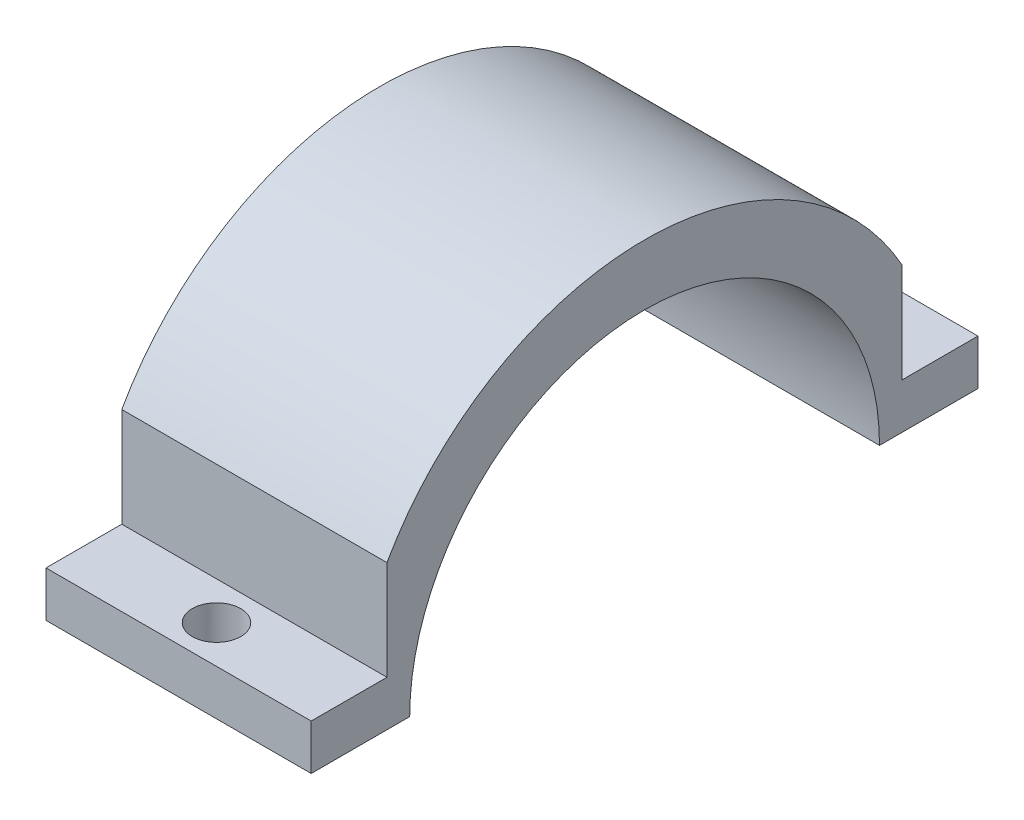
ISO-10303-21;
HEADER;
FILE_DESCRIPTION(('STEP AP214'),'2;1');
FILE_NAME('part.step','',(''),(''),'','','');
FILE_SCHEMA(('AUTOMOTIVE_DESIGN { 1 0 10303 214 1 1 1 1 }'));
ENDSEC;
DATA;
#1=APPLICATION_CONTEXT('core data for automotive mechanical design processes');
#2=APPLICATION_PROTOCOL_DEFINITION('international standard','automotive_design',2000,#1);
#3=PRODUCT_CONTEXT('',#1,'mechanical');
#4=PRODUCT('Part','Part','',(#3));
#5=PRODUCT_RELATED_PRODUCT_CATEGORY('part','',(#4));
#6=PRODUCT_DEFINITION_FORMATION('','',#4);
#7=PRODUCT_DEFINITION_CONTEXT('part definition',#1,'design');
#8=PRODUCT_DEFINITION('design','',#6,#7);
#9=PRODUCT_DEFINITION_SHAPE('','',#8);
#10=(LENGTH_UNIT() NAMED_UNIT(*) SI_UNIT(.MILLI.,.METRE.));
#11=(NAMED_UNIT(*) PLANE_ANGLE_UNIT() SI_UNIT($,.RADIAN.));
#12=(NAMED_UNIT(*) SI_UNIT($,.STERADIAN.) SOLID_ANGLE_UNIT());
#13=UNCERTAINTY_MEASURE_WITH_UNIT(LENGTH_MEASURE(1.E-05),#10,'distance_accuracy_value','');
#14=(GEOMETRIC_REPRESENTATION_CONTEXT(3) GLOBAL_UNCERTAINTY_ASSIGNED_CONTEXT((#13)) GLOBAL_UNIT_ASSIGNED_CONTEXT((#10,
#11,#12)) REPRESENTATION_CONTEXT('',''));
#15=CARTESIAN_POINT('',(0.,0.,0.));
#16=DIRECTION('',(0.,0.,1.));
#17=DIRECTION('',(1.,0.,0.));
#18=AXIS2_PLACEMENT_3D('',#15,#16,#17);
#19=CARTESIAN_POINT('',(17.,50.,0.));
#20=DIRECTION('',(-1.,0.,0.));
#21=DIRECTION('',(0.,0.,1.));
#22=AXIS2_PLACEMENT_3D('',#19,#20,#21);
#23=PLANE('',#22);
#24=CARTESIAN_POINT('',(17.,4.5,22.));
#25=DIRECTION('',(-1.,0.,0.));
#26=DIRECTION('',(0.,0.,1.));
#27=AXIS2_PLACEMENT_3D('',#24,#25,#26);
#28=CIRCLE('',#27,19.5);
#29=CARTESIAN_POINT('',(17.,14.0524865872714,39.));
#30=VERTEX_POINT('',#29);
#31=CARTESIAN_POINT('',(17.,14.0524865872713,5.00000000000001));
#32=VERTEX_POINT('',#31);
#33=EDGE_CURVE('E71',#30,#32,#28,.T.);
#34=ORIENTED_EDGE('',*,*,#33,.F.);
#35=DIRECTION('',(0.,-1.,0.));
#36=VECTOR('',#35,1.);
#37=CARTESIAN_POINT('',(17.,50.,39.));
#38=LINE('',#37,#36);
#39=CARTESIAN_POINT('',(17.,7.5,39.));
#40=VERTEX_POINT('',#39);
#41=EDGE_CURVE('E44',#30,#40,#38,.T.);
#42=ORIENTED_EDGE('',*,*,#41,.T.);
#43=DIRECTION('',(0.,0.,-1.));
#44=VECTOR('',#43,1.);
#45=CARTESIAN_POINT('',(17.,7.5,39.));
#46=LINE('',#45,#44);
#47=CARTESIAN_POINT('',(17.,7.5,44.));
#48=VERTEX_POINT('',#47);
#49=EDGE_CURVE('E174',#48,#40,#46,.T.);
#50=ORIENTED_EDGE('',*,*,#49,.F.);
#51=DIRECTION('',(0.,1.,0.));
#52=VECTOR('',#51,1.);
#53=CARTESIAN_POINT('',(17.,7.5,44.));
#54=LINE('',#53,#52);
#55=CARTESIAN_POINT('',(17.,4.5,44.));
#56=VERTEX_POINT('',#55);
#57=EDGE_CURVE('E179',#56,#48,#54,.T.);
#58=ORIENTED_EDGE('',*,*,#57,.F.);
#59=DIRECTION('',(0.,0.,1.));
#60=VECTOR('',#59,1.);
#61=CARTESIAN_POINT('',(17.,4.5,0.));
#62=LINE('',#61,#60);
#63=CARTESIAN_POINT('',(17.,4.5,37.5));
#64=VERTEX_POINT('',#63);
#65=EDGE_CURVE('E134',#64,#56,#62,.T.);
#66=ORIENTED_EDGE('',*,*,#65,.F.);
#67=CARTESIAN_POINT('',(17.,4.50000000000002,22.));
#68=DIRECTION('',(1.,0.,0.));
#69=DIRECTION('',(0.,0.,-1.));
#70=AXIS2_PLACEMENT_3D('',#67,#68,#69);
#71=CIRCLE('',#70,15.5);
#72=CARTESIAN_POINT('',(17.,4.5,6.50000000000006));
#73=VERTEX_POINT('',#72);
#74=EDGE_CURVE('E133',#73,#64,#71,.T.);
#75=ORIENTED_EDGE('',*,*,#74,.F.);
#76=CARTESIAN_POINT('',(17.,4.5,0.));
#77=VERTEX_POINT('',#76);
#78=EDGE_CURVE('E147',#77,#73,#62,.T.);
#79=ORIENTED_EDGE('',*,*,#78,.F.);
#80=DIRECTION('',(0.,-1.,0.));
#81=VECTOR('',#80,1.);
#82=CARTESIAN_POINT('',(17.,7.5,0.));
#83=LINE('',#82,#81);
#84=CARTESIAN_POINT('',(17.,7.5,0.));
#85=VERTEX_POINT('',#84);
#86=EDGE_CURVE('E191',#85,#77,#83,.T.);
#87=ORIENTED_EDGE('',*,*,#86,.F.);
#88=DIRECTION('',(0.,0.,-1.));
#89=VECTOR('',#88,1.);
#90=CARTESIAN_POINT('',(17.,7.5,5.00000000000001));
#91=LINE('',#90,#89);
#92=CARTESIAN_POINT('',(17.,7.5,5.00000000000001));
#93=VERTEX_POINT('',#92);
#94=EDGE_CURVE('E188',#93,#85,#91,.T.);
#95=ORIENTED_EDGE('',*,*,#94,.F.);
#96=DIRECTION('',(0.,1.,0.));
#97=VECTOR('',#96,1.);
#98=CARTESIAN_POINT('',(17.,0.,5.));
#99=LINE('',#98,#97);
#100=EDGE_CURVE('E157',#93,#32,#99,.T.);
#101=ORIENTED_EDGE('',*,*,#100,.T.);
#102=EDGE_LOOP('',(#34,#42,#50,#58,#66,#75,#79,#87,#95,#101));
#103=FACE_BOUND('',#102,.T.);
#104=ADVANCED_FACE('F35',(#103),#23,.F.);
#105=CARTESIAN_POINT('',(-0.499999999999994,50.,0.));
#106=DIRECTION('',(-1.,0.,0.));
#107=DIRECTION('',(0.,0.,1.));
#108=AXIS2_PLACEMENT_3D('',#105,#106,#107);
#109=PLANE('',#108);
#110=DIRECTION('',(0.,-1.,0.));
#111=VECTOR('',#110,1.);
#112=CARTESIAN_POINT('',(-0.499999999999917,50.,39.));
#113=LINE('',#112,#111);
#114=CARTESIAN_POINT('',(-0.499999999999917,14.0524865872714,39.));
#115=VERTEX_POINT('',#114);
#116=CARTESIAN_POINT('',(-0.499999999999994,7.5,39.));
#117=VERTEX_POINT('',#116);
#118=EDGE_CURVE('E160',#115,#117,#113,.T.);
#119=ORIENTED_EDGE('',*,*,#118,.F.);
#120=CARTESIAN_POINT('',(-0.499999999999952,4.5,22.));
#121=DIRECTION('',(-1.,0.,0.));
#122=DIRECTION('',(0.,0.,1.));
#123=AXIS2_PLACEMENT_3D('',#120,#121,#122);
#124=CIRCLE('',#123,19.5);
#125=CARTESIAN_POINT('',(-0.499999999999973,14.0524865872713,5.00000000000001));
#126=VERTEX_POINT('',#125);
#127=EDGE_CURVE('E38',#115,#126,#124,.T.);
#128=ORIENTED_EDGE('',*,*,#127,.T.);
#129=DIRECTION('',(0.,1.,0.));
#130=VECTOR('',#129,1.);
#131=CARTESIAN_POINT('',(-0.499999999999994,0.,5.));
#132=LINE('',#131,#130);
#133=CARTESIAN_POINT('',(-0.499999999999994,7.5,5.));
#134=VERTEX_POINT('',#133);
#135=EDGE_CURVE('E154',#134,#126,#132,.T.);
#136=ORIENTED_EDGE('',*,*,#135,.F.);
#137=DIRECTION('',(0.,0.,-1.));
#138=VECTOR('',#137,1.);
#139=CARTESIAN_POINT('',(-0.499999999999994,7.5,5.00000000000001));
#140=LINE('',#139,#138);
#141=CARTESIAN_POINT('',(-0.499999999999994,7.5,0.));
#142=VERTEX_POINT('',#141);
#143=EDGE_CURVE('E175',#134,#142,#140,.T.);
#144=ORIENTED_EDGE('',*,*,#143,.T.);
#145=DIRECTION('',(0.,-1.,0.));
#146=VECTOR('',#145,1.);
#147=CARTESIAN_POINT('',(-0.499999999999994,7.5,0.));
#148=LINE('',#147,#146);
#149=CARTESIAN_POINT('',(-0.499999999999994,4.5,0.));
#150=VERTEX_POINT('',#149);
#151=EDGE_CURVE('E143',#142,#150,#148,.T.);
#152=ORIENTED_EDGE('',*,*,#151,.T.);
#153=DIRECTION('',(0.,0.,1.));
#154=VECTOR('',#153,1.);
#155=CARTESIAN_POINT('',(-0.499999999999994,4.5,0.));
#156=LINE('',#155,#154);
#157=CARTESIAN_POINT('',(-0.499999999999994,4.5,6.50000000000006));
#158=VERTEX_POINT('',#157);
#159=EDGE_CURVE('E125',#150,#158,#156,.T.);
#160=ORIENTED_EDGE('',*,*,#159,.T.);
#161=CARTESIAN_POINT('',(-0.49999999999995,4.50000000000002,22.));
#162=DIRECTION('',(-1.,0.,0.));
#163=DIRECTION('',(0.,0.,1.));
#164=AXIS2_PLACEMENT_3D('',#161,#162,#163);
#165=CIRCLE('',#164,15.5);
#166=CARTESIAN_POINT('',(-0.49999999999992,4.5,37.5));
#167=VERTEX_POINT('',#166);
#168=EDGE_CURVE('E11',#167,#158,#165,.T.);
#169=ORIENTED_EDGE('',*,*,#168,.F.);
#170=CARTESIAN_POINT('',(-0.499999999999994,4.5,44.));
#171=VERTEX_POINT('',#170);
#172=EDGE_CURVE('E114',#167,#171,#156,.T.);
#173=ORIENTED_EDGE('',*,*,#172,.T.);
#174=DIRECTION('',(0.,1.,0.));
#175=VECTOR('',#174,1.);
#176=CARTESIAN_POINT('',(-0.499999999999994,7.5,44.));
#177=LINE('',#176,#175);
#178=CARTESIAN_POINT('',(-0.499999999999994,7.5,44.));
#179=VERTEX_POINT('',#178);
#180=EDGE_CURVE('E178',#171,#179,#177,.T.);
#181=ORIENTED_EDGE('',*,*,#180,.T.);
#182=DIRECTION('',(0.,0.,-1.));
#183=VECTOR('',#182,1.);
#184=CARTESIAN_POINT('',(-0.499999999999994,7.5,39.));
#185=LINE('',#184,#183);
#186=EDGE_CURVE('E173',#179,#117,#185,.T.);
#187=ORIENTED_EDGE('',*,*,#186,.T.);
#188=EDGE_LOOP('',(#119,#128,#136,#144,#152,#160,#169,#173,#181,#187));
#189=FACE_BOUND('',#188,.T.);
#190=ADVANCED_FACE('F139',(#189),#109,.T.);
#191=CARTESIAN_POINT('',(17.,50.,39.));
#192=DIRECTION('',(0.,0.,-1.));
#193=DIRECTION('',(-1.,0.,0.));
#194=AXIS2_PLACEMENT_3D('',#191,#192,#193);
#195=PLANE('',#194);
#196=DIRECTION('',(-1.,0.,0.));
#197=VECTOR('',#196,1.);
#198=CARTESIAN_POINT('',(17.,14.0524865872714,39.));
#199=LINE('',#198,#197);
#200=EDGE_CURVE('E168',#30,#115,#199,.T.);
#201=ORIENTED_EDGE('',*,*,#200,.T.);
#202=ORIENTED_EDGE('',*,*,#118,.T.);
#203=DIRECTION('',(-1.,0.,0.));
#204=VECTOR('',#203,1.);
#205=CARTESIAN_POINT('',(17.,7.5,39.));
#206=LINE('',#205,#204);
#207=EDGE_CURVE('E166',#40,#117,#206,.T.);
#208=ORIENTED_EDGE('',*,*,#207,.F.);
#209=ORIENTED_EDGE('',*,*,#41,.F.);
#210=EDGE_LOOP('',(#201,#202,#208,#209));
#211=FACE_BOUND('',#210,.T.);
#212=ADVANCED_FACE('F165',(#211),#195,.F.);
#213=CARTESIAN_POINT('',(-0.499999999999994,0.,5.));
#214=DIRECTION('',(0.,0.,-1.));
#215=DIRECTION('',(0.,1.,0.));
#216=AXIS2_PLACEMENT_3D('',#213,#214,#215);
#217=PLANE('',#216);
#218=ORIENTED_EDGE('',*,*,#135,.T.);
#219=DIRECTION('',(-1.,0.,0.));
#220=VECTOR('',#219,1.);
#221=CARTESIAN_POINT('',(17.,14.0524865872713,5.00000000000001));
#222=LINE('',#221,#220);
#223=EDGE_CURVE('E65',#32,#126,#222,.T.);
#224=ORIENTED_EDGE('',*,*,#223,.F.);
#225=ORIENTED_EDGE('',*,*,#100,.F.);
#226=DIRECTION('',(-1.,0.,0.));
#227=VECTOR('',#226,1.);
#228=CARTESIAN_POINT('',(17.,7.5,5.00000000000001));
#229=LINE('',#228,#227);
#230=EDGE_CURVE('E150',#93,#134,#229,.T.);
#231=ORIENTED_EDGE('',*,*,#230,.T.);
#232=EDGE_LOOP('',(#218,#224,#225,#231));
#233=FACE_BOUND('',#232,.T.);
#234=ADVANCED_FACE('F202',(#233),#217,.T.);
#235=CARTESIAN_POINT('',(-0.49999999999999,4.50000000000002,22.));
#236=DIRECTION('',(1.,0.,0.));
#237=DIRECTION('',(0.,0.,-1.));
#238=AXIS2_PLACEMENT_3D('',#235,#236,#237);
#239=CYLINDRICAL_SURFACE('',#238,15.5);
#240=DIRECTION('',(1.,0.,0.));
#241=VECTOR('',#240,1.);
#242=CARTESIAN_POINT('',(-0.499999999999991,4.5,6.50000000000006));
#243=LINE('',#242,#241);
#244=EDGE_CURVE('E135',#73,#158,#243,.F.);
#245=ORIENTED_EDGE('',*,*,#244,.F.);
#246=ORIENTED_EDGE('',*,*,#74,.T.);
#247=DIRECTION('',(1.,0.,0.));
#248=VECTOR('',#247,1.);
#249=CARTESIAN_POINT('',(-0.499999999999989,4.5,37.5));
#250=LINE('',#249,#248);
#251=EDGE_CURVE('E117',#167,#64,#250,.T.);
#252=ORIENTED_EDGE('',*,*,#251,.F.);
#253=ORIENTED_EDGE('',*,*,#168,.T.);
#254=EDGE_LOOP('',(#245,#246,#252,#253));
#255=FACE_BOUND('',#254,.T.);
#256=ADVANCED_FACE('F131',(#255),#239,.F.);
#257=CARTESIAN_POINT('',(63.5,4.5,0.));
#258=DIRECTION('',(0.,-1.,0.));
#259=DIRECTION('',(0.,0.,-1.));
#260=AXIS2_PLACEMENT_3D('',#257,#258,#259);
#261=PLANE('',#260);
#262=CARTESIAN_POINT('',(8.25,4.5,2.50000000000001));
#263=DIRECTION('',(0.,-1.,0.));
#264=DIRECTION('',(0.,0.,-1.));
#265=AXIS2_PLACEMENT_3D('',#262,#263,#264);
#266=CIRCLE('',#265,1.6);
#267=CARTESIAN_POINT('',(8.25,4.5,0.900000000000004));
#268=VERTEX_POINT('',#267);
#269=EDGE_CURVE('E208',#268,#268,#266,.T.);
#270=ORIENTED_EDGE('',*,*,#269,.F.);
#271=EDGE_LOOP('',(#270));
#272=FACE_BOUND('',#271,.T.);
#273=ORIENTED_EDGE('',*,*,#244,.T.);
#274=ORIENTED_EDGE('',*,*,#159,.F.);
#275=DIRECTION('',(-1.,0.,0.));
#276=VECTOR('',#275,1.);
#277=CARTESIAN_POINT('',(17.,4.5,0.));
#278=LINE('',#277,#276);
#279=EDGE_CURVE('E126',#77,#150,#278,.T.);
#280=ORIENTED_EDGE('',*,*,#279,.F.);
#281=ORIENTED_EDGE('',*,*,#78,.T.);
#282=EDGE_LOOP('',(#273,#274,#280,#281));
#283=FACE_BOUND('',#282,.T.);
#284=ADVANCED_FACE('F248',(#272,#283),#261,.T.);
#285=CARTESIAN_POINT('',(8.25000000000004,4.5,41.5));
#286=DIRECTION('',(0.,-1.,0.));
#287=DIRECTION('',(0.,0.,-1.));
#288=AXIS2_PLACEMENT_3D('',#285,#286,#287);
#289=CIRCLE('',#288,1.6);
#290=CARTESIAN_POINT('',(8.25000000000004,4.5,39.9));
#291=VERTEX_POINT('',#290);
#292=EDGE_CURVE('E211',#291,#291,#289,.T.);
#293=ORIENTED_EDGE('',*,*,#292,.F.);
#294=EDGE_LOOP('',(#293));
#295=FACE_BOUND('',#294,.T.);
#296=ORIENTED_EDGE('',*,*,#65,.T.);
#297=DIRECTION('',(-1.,0.,0.));
#298=VECTOR('',#297,1.);
#299=CARTESIAN_POINT('',(17.,4.5,44.));
#300=LINE('',#299,#298);
#301=EDGE_CURVE('E120',#56,#171,#300,.T.);
#302=ORIENTED_EDGE('',*,*,#301,.T.);
#303=ORIENTED_EDGE('',*,*,#172,.F.);
#304=ORIENTED_EDGE('',*,*,#251,.T.);
#305=EDGE_LOOP('',(#296,#302,#303,#304));
#306=FACE_BOUND('',#305,.T.);
#307=ADVANCED_FACE('F116',(#295,#306),#261,.T.);
#308=CARTESIAN_POINT('',(17.,7.5,0.));
#309=DIRECTION('',(0.,0.,-1.));
#310=DIRECTION('',(0.,1.,0.));
#311=AXIS2_PLACEMENT_3D('',#308,#309,#310);
#312=PLANE('',#311);
#313=ORIENTED_EDGE('',*,*,#151,.F.);
#314=DIRECTION('',(-1.,0.,0.));
#315=VECTOR('',#314,1.);
#316=CARTESIAN_POINT('',(17.,7.5,0.));
#317=LINE('',#316,#315);
#318=EDGE_CURVE('E196',#85,#142,#317,.T.);
#319=ORIENTED_EDGE('',*,*,#318,.F.);
#320=ORIENTED_EDGE('',*,*,#86,.T.);
#321=ORIENTED_EDGE('',*,*,#279,.T.);
#322=EDGE_LOOP('',(#313,#319,#320,#321));
#323=FACE_BOUND('',#322,.T.);
#324=ADVANCED_FACE('F225',(#323),#312,.T.);
#325=CARTESIAN_POINT('',(17.,7.5,5.00000000000001));
#326=DIRECTION('',(0.,1.,0.));
#327=DIRECTION('',(0.,0.,1.));
#328=AXIS2_PLACEMENT_3D('',#325,#326,#327);
#329=PLANE('',#328);
#330=CARTESIAN_POINT('',(8.25,7.5,2.5));
#331=DIRECTION('',(0.,1.,0.));
#332=DIRECTION('',(0.,0.,1.));
#333=AXIS2_PLACEMENT_3D('',#330,#331,#332);
#334=CIRCLE('',#333,1.6);
#335=CARTESIAN_POINT('',(8.25,7.5,4.10000000000001));
#336=VERTEX_POINT('',#335);
#337=EDGE_CURVE('E214',#336,#336,#334,.T.);
#338=ORIENTED_EDGE('',*,*,#337,.F.);
#339=EDGE_LOOP('',(#338));
#340=FACE_BOUND('',#339,.T.);
#341=ORIENTED_EDGE('',*,*,#143,.F.);
#342=ORIENTED_EDGE('',*,*,#230,.F.);
#343=ORIENTED_EDGE('',*,*,#94,.T.);
#344=ORIENTED_EDGE('',*,*,#318,.T.);
#345=EDGE_LOOP('',(#341,#342,#343,#344));
#346=FACE_BOUND('',#345,.T.);
#347=ADVANCED_FACE('F223',(#340,#346),#329,.T.);
#348=CARTESIAN_POINT('',(17.,7.5,39.));
#349=DIRECTION('',(0.,1.,0.));
#350=DIRECTION('',(0.,0.,1.));
#351=AXIS2_PLACEMENT_3D('',#348,#349,#350);
#352=PLANE('',#351);
#353=CARTESIAN_POINT('',(8.25000000000004,7.50000000000001,41.5));
#354=DIRECTION('',(0.,1.,0.));
#355=DIRECTION('',(0.,0.,1.));
#356=AXIS2_PLACEMENT_3D('',#353,#354,#355);
#357=CIRCLE('',#356,1.6);
#358=CARTESIAN_POINT('',(8.25000000000004,7.50000000000001,43.1));
#359=VERTEX_POINT('',#358);
#360=EDGE_CURVE('E215',#359,#359,#357,.T.);
#361=ORIENTED_EDGE('',*,*,#360,.F.);
#362=EDGE_LOOP('',(#361));
#363=FACE_BOUND('',#362,.T.);
#364=ORIENTED_EDGE('',*,*,#186,.F.);
#365=DIRECTION('',(-1.,0.,0.));
#366=VECTOR('',#365,1.);
#367=CARTESIAN_POINT('',(17.,7.5,44.));
#368=LINE('',#367,#366);
#369=EDGE_CURVE('E176',#48,#179,#368,.T.);
#370=ORIENTED_EDGE('',*,*,#369,.F.);
#371=ORIENTED_EDGE('',*,*,#49,.T.);
#372=ORIENTED_EDGE('',*,*,#207,.T.);
#373=EDGE_LOOP('',(#364,#370,#371,#372));
#374=FACE_BOUND('',#373,.T.);
#375=ADVANCED_FACE('F172',(#363,#374),#352,.T.);
#376=CARTESIAN_POINT('',(17.,7.5,44.));
#377=DIRECTION('',(0.,0.,1.));
#378=DIRECTION('',(1.,0.,0.));
#379=AXIS2_PLACEMENT_3D('',#376,#377,#378);
#380=PLANE('',#379);
#381=ORIENTED_EDGE('',*,*,#180,.F.);
#382=ORIENTED_EDGE('',*,*,#301,.F.);
#383=ORIENTED_EDGE('',*,*,#57,.T.);
#384=ORIENTED_EDGE('',*,*,#369,.T.);
#385=EDGE_LOOP('',(#381,#382,#383,#384));
#386=FACE_BOUND('',#385,.T.);
#387=ADVANCED_FACE('F231',(#386),#380,.T.);
#388=CARTESIAN_POINT('',(17.,4.5,22.));
#389=DIRECTION('',(-1.,0.,0.));
#390=DIRECTION('',(0.,0.,1.));
#391=AXIS2_PLACEMENT_3D('',#388,#389,#390);
#392=CYLINDRICAL_SURFACE('',#391,19.5);
#393=ORIENTED_EDGE('',*,*,#127,.F.);
#394=ORIENTED_EDGE('',*,*,#200,.F.);
#395=ORIENTED_EDGE('',*,*,#33,.T.);
#396=ORIENTED_EDGE('',*,*,#223,.T.);
#397=EDGE_LOOP('',(#393,#394,#395,#396));
#398=FACE_BOUND('',#397,.T.);
#399=ADVANCED_FACE('F261',(#398),#392,.T.);
#400=CARTESIAN_POINT('',(8.25000000000004,-56.5,41.5));
#401=DIRECTION('',(0.,1.,0.));
#402=DIRECTION('',(0.,0.,1.));
#403=AXIS2_PLACEMENT_3D('',#400,#401,#402);
#404=CYLINDRICAL_SURFACE('',#403,1.6);
#405=ORIENTED_EDGE('',*,*,#292,.T.);
#406=EDGE_LOOP('',(#405));
#407=FACE_BOUND('',#406,.T.);
#408=ORIENTED_EDGE('',*,*,#360,.T.);
#409=EDGE_LOOP('',(#408));
#410=FACE_BOUND('',#409,.T.);
#411=ADVANCED_FACE('F258',(#407,#410),#404,.F.);
#412=CARTESIAN_POINT('',(8.25,-56.5,2.50000000000002));
#413=DIRECTION('',(0.,1.,0.));
#414=DIRECTION('',(0.,0.,1.));
#415=AXIS2_PLACEMENT_3D('',#412,#413,#414);
#416=CYLINDRICAL_SURFACE('',#415,1.6);
#417=ORIENTED_EDGE('',*,*,#269,.T.);
#418=EDGE_LOOP('',(#417));
#419=FACE_BOUND('',#418,.T.);
#420=ORIENTED_EDGE('',*,*,#337,.T.);
#421=EDGE_LOOP('',(#420));
#422=FACE_BOUND('',#421,.T.);
#423=ADVANCED_FACE('F221',(#419,#422),#416,.F.);
#424=CLOSED_SHELL('',(#104,#190,#212,#234,#256,#284,#307,#324,#347,#375,#387,#399,#411,#423));
#425=MANIFOLD_SOLID_BREP('B2',#424);
#426=ADVANCED_BREP_SHAPE_REPRESENTATION('',(#18,#425),#14);
#427=SHAPE_DEFINITION_REPRESENTATION(#9,#426);
ENDSEC;
END-ISO-10303-21;
